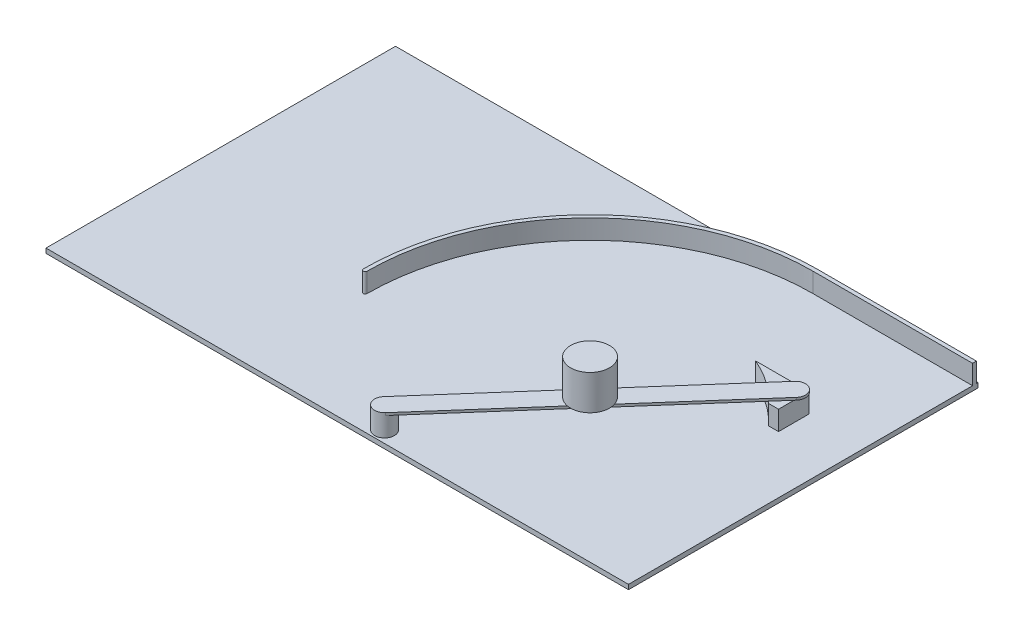
ISO-10303-21;
HEADER;
FILE_DESCRIPTION(('STEP AP214'),'2;1');
FILE_NAME('part.step','',(''),(''),'','','');
FILE_SCHEMA(('AUTOMOTIVE_DESIGN { 1 0 10303 214 1 1 1 1 }'));
ENDSEC;
DATA;
#1=APPLICATION_CONTEXT('core data for automotive mechanical design processes');
#2=APPLICATION_PROTOCOL_DEFINITION('international standard','automotive_design',2000,#1);
#3=PRODUCT_CONTEXT('',#1,'mechanical');
#4=PRODUCT('Part','Part','',(#3));
#5=PRODUCT_RELATED_PRODUCT_CATEGORY('part','',(#4));
#6=PRODUCT_DEFINITION_FORMATION('','',#4);
#7=PRODUCT_DEFINITION_CONTEXT('part definition',#1,'design');
#8=PRODUCT_DEFINITION('design','',#6,#7);
#9=PRODUCT_DEFINITION_SHAPE('','',#8);
#10=(LENGTH_UNIT() NAMED_UNIT(*) SI_UNIT(.MILLI.,.METRE.));
#11=(NAMED_UNIT(*) PLANE_ANGLE_UNIT() SI_UNIT($,.RADIAN.));
#12=(NAMED_UNIT(*) SI_UNIT($,.STERADIAN.) SOLID_ANGLE_UNIT());
#13=UNCERTAINTY_MEASURE_WITH_UNIT(LENGTH_MEASURE(1.E-05),#10,'distance_accuracy_value','');
#14=(GEOMETRIC_REPRESENTATION_CONTEXT(3) GLOBAL_UNCERTAINTY_ASSIGNED_CONTEXT((#13)) GLOBAL_UNIT_ASSIGNED_CONTEXT((#10,
#11,#12)) REPRESENTATION_CONTEXT('',''));
#15=CARTESIAN_POINT('',(0.,0.,0.));
#16=DIRECTION('',(0.,0.,1.));
#17=DIRECTION('',(1.,0.,0.));
#18=AXIS2_PLACEMENT_3D('',#15,#16,#17);
#19=CARTESIAN_POINT('',(91.5119390357836,68.35,419.73508776894));
#20=DIRECTION('',(0.,1.,0.));
#21=DIRECTION('',(0.,0.,1.));
#22=AXIS2_PLACEMENT_3D('',#19,#20,#21);
#23=PLANE('',#22);
#24=CARTESIAN_POINT('',(339.,68.35,138.));
#25=DIRECTION('',(0.,1.,0.));
#26=DIRECTION('',(0.,0.,1.));
#27=AXIS2_PLACEMENT_3D('',#24,#25,#26);
#28=CIRCLE('',#27,50.);
#29=CARTESIAN_POINT('',(386.506268712775,68.35,122.406590078191));
#30=VERTEX_POINT('',#29);
#31=CARTESIAN_POINT('',(348.340555489676,68.35,88.8802074195719));
#32=VERTEX_POINT('',#31);
#33=EDGE_CURVE('E50',#30,#32,#28,.T.);
#34=ORIENTED_EDGE('',*,*,#33,.F.);
#35=DIRECTION('',(0.659968162571244,0.,-0.75129356738384));
#36=VECTOR('',#35,1.);
#37=CARTESIAN_POINT('',(110.594795647333,68.35,436.498279098249));
#38=LINE('',#37,#36);
#39=CARTESIAN_POINT('',(605.570917575766,68.35,-126.97189643963));
#40=VERTEX_POINT('',#39);
#41=EDGE_CURVE('E200',#30,#40,#38,.T.);
#42=ORIENTED_EDGE('',*,*,#41,.T.);
#43=CARTESIAN_POINT('',(586.488060964216,68.35,-143.73508776894));
#44=DIRECTION('',(0.,1.,0.));
#45=DIRECTION('',(0.,0.,1.));
#46=AXIS2_PLACEMENT_3D('',#43,#44,#45);
#47=CIRCLE('',#46,25.4);
#48=CARTESIAN_POINT('',(567.405204352667,68.35,-160.498279098249));
#49=VERTEX_POINT('',#48);
#50=EDGE_CURVE('E197',#40,#49,#47,.T.);
#51=ORIENTED_EDGE('',*,*,#50,.T.);
#52=DIRECTION('',(-0.659968162571244,0.,0.75129356738384));
#53=VECTOR('',#52,1.);
#54=CARTESIAN_POINT('',(72.4290824242341,68.35,402.97189643963));
#55=LINE('',#54,#53);
#56=EDGE_CURVE('E230',#49,#32,#55,.T.);
#57=ORIENTED_EDGE('',*,*,#56,.T.);
#58=EDGE_LOOP('',(#34,#42,#51,#57));
#59=FACE_BOUND('',#58,.T.);
#60=ADVANCED_FACE('F39',(#59),#23,.T.);
#61=CARTESIAN_POINT('',(91.5119390357836,62.,419.73508776894));
#62=DIRECTION('',(0.,1.,0.));
#63=DIRECTION('',(0.,0.,1.));
#64=AXIS2_PLACEMENT_3D('',#61,#62,#63);
#65=PLANE('',#64);
#66=CARTESIAN_POINT('',(91.5119390357836,62.,419.73508776894));
#67=DIRECTION('',(0.,1.,0.));
#68=DIRECTION('',(0.,0.,1.));
#69=AXIS2_PLACEMENT_3D('',#66,#67,#68);
#70=CIRCLE('',#69,25.4);
#71=CARTESIAN_POINT('',(110.594795647333,62.,436.498279098249));
#72=VERTEX_POINT('',#71);
#73=CARTESIAN_POINT('',(72.429082424234,62.,402.97189643963));
#74=VERTEX_POINT('',#73);
#75=EDGE_CURVE('E223',#72,#74,#70,.T.);
#76=ORIENTED_EDGE('',*,*,#75,.T.);
#77=DIRECTION('',(-0.659968162571244,0.,0.75129356738384));
#78=VECTOR('',#77,1.);
#79=CARTESIAN_POINT('',(72.4290824242341,62.,402.97189643963));
#80=LINE('',#79,#78);
#81=CARTESIAN_POINT('',(534.015535145489,62.,-122.488197529021));
#82=VERTEX_POINT('',#81);
#83=EDGE_CURVE('E239',#82,#74,#80,.T.);
#84=ORIENTED_EDGE('',*,*,#83,.F.);
#85=CARTESIAN_POINT('',(339.,62.,138.));
#86=DIRECTION('',(0.,-1.,0.));
#87=DIRECTION('',(0.,0.,-1.));
#88=AXIS2_PLACEMENT_3D('',#85,#86,#87);
#89=CIRCLE('',#88,325.4);
#90=CARTESIAN_POINT('',(572.181248368588,62.,-88.9618148704022));
#91=VERTEX_POINT('',#90);
#92=EDGE_CURVE('E257',#82,#91,#89,.T.);
#93=ORIENTED_EDGE('',*,*,#92,.T.);
#94=DIRECTION('',(0.659968162571244,0.,-0.75129356738384));
#95=VECTOR('',#94,1.);
#96=CARTESIAN_POINT('',(110.594795647333,62.,436.498279098249));
#97=LINE('',#96,#95);
#98=EDGE_CURVE('E233',#72,#91,#97,.T.);
#99=ORIENTED_EDGE('',*,*,#98,.F.);
#100=EDGE_LOOP('',(#76,#84,#93,#99));
#101=FACE_BOUND('',#100,.T.);
#102=ADVANCED_FACE('F388',(#101),#65,.F.);
#103=CARTESIAN_POINT('',(339.,62.,138.));
#104=DIRECTION('',(0.,-1.,0.));
#105=DIRECTION('',(0.,0.,-1.));
#106=AXIS2_PLACEMENT_3D('',#103,#104,#105);
#107=PLANE('',#106);
#108=CARTESIAN_POINT('',(567.405204352667,62.,-160.498279098249));
#109=VERTEX_POINT('',#108);
#110=EDGE_CURVE('E226',#109,#82,#80,.T.);
#111=ORIENTED_EDGE('',*,*,#110,.F.);
#112=CARTESIAN_POINT('',(586.488060964216,62.,-143.73508776894));
#113=DIRECTION('',(0.,1.,0.));
#114=DIRECTION('',(0.,0.,1.));
#115=AXIS2_PLACEMENT_3D('',#112,#113,#114);
#116=CIRCLE('',#115,25.4);
#117=CARTESIAN_POINT('',(568.837197495488,62.,-162.));
#118=VERTEX_POINT('',#117);
#119=EDGE_CURVE('E48',#118,#109,#116,.T.);
#120=ORIENTED_EDGE('',*,*,#119,.F.);
#121=DIRECTION('',(-1.,0.,0.));
#122=VECTOR('',#121,1.);
#123=CARTESIAN_POINT('',(602.532735227345,62.,-162.));
#124=LINE('',#123,#122);
#125=CARTESIAN_POINT('',(465.036343964747,62.,-162.));
#126=VERTEX_POINT('',#125);
#127=EDGE_CURVE('E263',#118,#126,#124,.T.);
#128=ORIENTED_EDGE('',*,*,#127,.T.);
#129=EDGE_CURVE('E253',#126,#82,#89,.T.);
#130=ORIENTED_EDGE('',*,*,#129,.T.);
#131=EDGE_LOOP('',(#111,#120,#128,#130));
#132=FACE_BOUND('',#131,.T.);
#133=ADVANCED_FACE('F382',(#132),#107,.F.);
#134=CARTESIAN_POINT('',(602.532735227345,62.,-123.513294973138));
#135=VERTEX_POINT('',#134);
#136=EDGE_CURVE('E236',#91,#135,#97,.T.);
#137=ORIENTED_EDGE('',*,*,#136,.F.);
#138=CARTESIAN_POINT('',(577.132735227345,62.,-83.7610434975968));
#139=VERTEX_POINT('',#138);
#140=EDGE_CURVE('E258',#91,#139,#89,.T.);
#141=ORIENTED_EDGE('',*,*,#140,.T.);
#142=DIRECTION('',(1.,0.,0.));
#143=VECTOR('',#142,1.);
#144=CARTESIAN_POINT('',(602.532735227345,62.,-83.7610434975968));
#145=LINE('',#144,#143);
#146=CARTESIAN_POINT('',(602.532735227345,62.,-83.7610434975968));
#147=VERTEX_POINT('',#146);
#148=EDGE_CURVE('E256',#139,#147,#145,.T.);
#149=ORIENTED_EDGE('',*,*,#148,.T.);
#150=DIRECTION('',(0.,0.,-1.));
#151=VECTOR('',#150,1.);
#152=CARTESIAN_POINT('',(602.532735227345,62.,-162.));
#153=LINE('',#152,#151);
#154=EDGE_CURVE('E261',#147,#135,#153,.T.);
#155=ORIENTED_EDGE('',*,*,#154,.T.);
#156=EDGE_LOOP('',(#137,#141,#149,#155));
#157=FACE_BOUND('',#156,.T.);
#158=ADVANCED_FACE('F417',(#157),#107,.F.);
#159=CARTESIAN_POINT('',(0.,12.,0.));
#160=DIRECTION('',(0.,1.,0.));
#161=DIRECTION('',(0.,0.,1.));
#162=AXIS2_PLACEMENT_3D('',#159,#160,#161);
#163=PLANE('',#162);
#164=CARTESIAN_POINT('',(91.5119390357836,12.,419.73508776894));
#165=DIRECTION('',(0.,1.,0.));
#166=DIRECTION('',(0.,0.,1.));
#167=AXIS2_PLACEMENT_3D('',#164,#165,#166);
#168=CIRCLE('',#167,25.4);
#169=CARTESIAN_POINT('',(91.5119390357836,12.,445.13508776894));
#170=VERTEX_POINT('',#169);
#171=EDGE_CURVE('E220',#170,#170,#168,.T.);
#172=ORIENTED_EDGE('',*,*,#171,.F.);
#173=EDGE_LOOP('',(#172));
#174=FACE_BOUND('',#173,.T.);
#175=DIRECTION('',(1.,0.,0.));
#176=VECTOR('',#175,1.);
#177=CARTESIAN_POINT('',(339.,12.,-436.));
#178=LINE('',#177,#176);
#179=CARTESIAN_POINT('',(339.,12.,-436.));
#180=VERTEX_POINT('',#179);
#181=CARTESIAN_POINT('',(750.,12.,-436.));
#182=VERTEX_POINT('',#181);
#183=EDGE_CURVE('E286',#180,#182,#178,.T.);
#184=ORIENTED_EDGE('',*,*,#183,.F.);
#185=CARTESIAN_POINT('',(339.,12.,138.));
#186=DIRECTION('',(0.,1.,0.));
#187=DIRECTION('',(0.,0.,1.));
#188=AXIS2_PLACEMENT_3D('',#185,#186,#187);
#189=CIRCLE('',#188,574.);
#190=CARTESIAN_POINT('',(-235.,12.,138.));
#191=VERTEX_POINT('',#190);
#192=EDGE_CURVE('E290',#180,#191,#189,.T.);
#193=ORIENTED_EDGE('',*,*,#192,.T.);
#194=CARTESIAN_POINT('',(-240.,12.,138.));
#195=DIRECTION('',(0.,-1.,0.));
#196=DIRECTION('',(0.,0.,-1.));
#197=AXIS2_PLACEMENT_3D('',#194,#195,#196);
#198=CIRCLE('',#197,5.);
#199=CARTESIAN_POINT('',(-245.,12.,138.));
#200=VERTEX_POINT('',#199);
#201=EDGE_CURVE('E313',#191,#200,#198,.T.);
#202=ORIENTED_EDGE('',*,*,#201,.T.);
#203=CARTESIAN_POINT('',(339.,12.,138.));
#204=DIRECTION('',(0.,1.,0.));
#205=DIRECTION('',(0.,0.,1.));
#206=AXIS2_PLACEMENT_3D('',#203,#204,#205);
#207=CIRCLE('',#206,584.);
#208=CARTESIAN_POINT('',(339.,12.,-446.));
#209=VERTEX_POINT('',#208);
#210=EDGE_CURVE('E310',#209,#200,#207,.T.);
#211=ORIENTED_EDGE('',*,*,#210,.F.);
#212=DIRECTION('',(1.,0.,0.));
#213=VECTOR('',#212,1.);
#214=CARTESIAN_POINT('',(339.,12.,-446.));
#215=LINE('',#214,#213);
#216=CARTESIAN_POINT('',(750.,12.,-446.));
#217=VERTEX_POINT('',#216);
#218=EDGE_CURVE('E307',#209,#217,#215,.T.);
#219=ORIENTED_EDGE('',*,*,#218,.T.);
#220=DIRECTION('',(0.,0.,-1.));
#221=VECTOR('',#220,1.);
#222=CARTESIAN_POINT('',(750.,12.,450.));
#223=LINE('',#222,#221);
#224=CARTESIAN_POINT('',(750.,12.,-450.));
#225=VERTEX_POINT('',#224);
#226=EDGE_CURVE('E336',#217,#225,#223,.T.);
#227=ORIENTED_EDGE('',*,*,#226,.T.);
#228=DIRECTION('',(-1.,0.,0.));
#229=VECTOR('',#228,1.);
#230=CARTESIAN_POINT('',(750.,12.,-450.));
#231=LINE('',#230,#229);
#232=CARTESIAN_POINT('',(-750.,12.,-450.));
#233=VERTEX_POINT('',#232);
#234=EDGE_CURVE('E340',#225,#233,#231,.T.);
#235=ORIENTED_EDGE('',*,*,#234,.T.);
#236=DIRECTION('',(0.,0.,1.));
#237=VECTOR('',#236,1.);
#238=CARTESIAN_POINT('',(-750.,12.,450.));
#239=LINE('',#238,#237);
#240=CARTESIAN_POINT('',(-750.,12.,450.));
#241=VERTEX_POINT('',#240);
#242=EDGE_CURVE('E330',#233,#241,#239,.T.);
#243=ORIENTED_EDGE('',*,*,#242,.T.);
#244=DIRECTION('',(1.,0.,0.));
#245=VECTOR('',#244,1.);
#246=CARTESIAN_POINT('',(750.,12.,450.));
#247=LINE('',#246,#245);
#248=CARTESIAN_POINT('',(750.,12.,450.));
#249=VERTEX_POINT('',#248);
#250=EDGE_CURVE('E333',#241,#249,#247,.T.);
#251=ORIENTED_EDGE('',*,*,#250,.T.);
#252=EDGE_CURVE('E337',#249,#182,#223,.T.);
#253=ORIENTED_EDGE('',*,*,#252,.T.);
#254=EDGE_LOOP('',(#184,#193,#202,#211,#219,#227,#235,#243,#251,#253));
#255=FACE_BOUND('',#254,.T.);
#256=DIRECTION('',(1.,0.,0.));
#257=VECTOR('',#256,1.);
#258=CARTESIAN_POINT('',(602.532735227345,12.,-83.7610434975968));
#259=LINE('',#258,#257);
#260=CARTESIAN_POINT('',(577.132735227345,12.,-83.7610434975968));
#261=VERTEX_POINT('',#260);
#262=CARTESIAN_POINT('',(602.532735227345,12.,-83.7610434975968));
#263=VERTEX_POINT('',#262);
#264=EDGE_CURVE('E270',#261,#263,#259,.T.);
#265=ORIENTED_EDGE('',*,*,#264,.F.);
#266=CARTESIAN_POINT('',(339.,12.,138.));
#267=DIRECTION('',(0.,-1.,0.));
#268=DIRECTION('',(0.,0.,-1.));
#269=AXIS2_PLACEMENT_3D('',#266,#267,#268);
#270=CIRCLE('',#269,325.4);
#271=CARTESIAN_POINT('',(465.036343964747,12.,-162.));
#272=VERTEX_POINT('',#271);
#273=EDGE_CURVE('E252',#272,#261,#270,.T.);
#274=ORIENTED_EDGE('',*,*,#273,.F.);
#275=DIRECTION('',(-1.,0.,0.));
#276=VECTOR('',#275,1.);
#277=CARTESIAN_POINT('',(602.532735227345,12.,-162.));
#278=LINE('',#277,#276);
#279=CARTESIAN_POINT('',(602.532735227345,12.,-162.));
#280=VERTEX_POINT('',#279);
#281=EDGE_CURVE('E275',#280,#272,#278,.T.);
#282=ORIENTED_EDGE('',*,*,#281,.F.);
#283=DIRECTION('',(0.,0.,-1.));
#284=VECTOR('',#283,1.);
#285=CARTESIAN_POINT('',(602.532735227345,12.,-162.));
#286=LINE('',#285,#284);
#287=EDGE_CURVE('E272',#263,#280,#286,.T.);
#288=ORIENTED_EDGE('',*,*,#287,.F.);
#289=EDGE_LOOP('',(#265,#274,#282,#288));
#290=FACE_BOUND('',#289,.T.);
#291=ADVANCED_FACE('F457',(#174,#255,#290),#163,.T.);
#292=CARTESIAN_POINT('',(-750.,12.,450.));
#293=DIRECTION('',(1.,0.,0.));
#294=DIRECTION('',(0.,0.,-1.));
#295=AXIS2_PLACEMENT_3D('',#292,#293,#294);
#296=PLANE('',#295);
#297=DIRECTION('',(0.,0.,1.));
#298=VECTOR('',#297,1.);
#299=CARTESIAN_POINT('',(-750.,0.,450.));
#300=LINE('',#299,#298);
#301=CARTESIAN_POINT('',(-750.,0.,-450.));
#302=VERTEX_POINT('',#301);
#303=CARTESIAN_POINT('',(-750.,0.,450.));
#304=VERTEX_POINT('',#303);
#305=EDGE_CURVE('E329',#302,#304,#300,.T.);
#306=ORIENTED_EDGE('',*,*,#305,.T.);
#307=DIRECTION('',(0.,-1.,0.));
#308=VECTOR('',#307,1.);
#309=CARTESIAN_POINT('',(-750.,12.,450.));
#310=LINE('',#309,#308);
#311=EDGE_CURVE('E43',#241,#304,#310,.T.);
#312=ORIENTED_EDGE('',*,*,#311,.F.);
#313=ORIENTED_EDGE('',*,*,#242,.F.);
#314=DIRECTION('',(0.,-1.,0.));
#315=VECTOR('',#314,1.);
#316=CARTESIAN_POINT('',(-750.,12.,-450.));
#317=LINE('',#316,#315);
#318=EDGE_CURVE('E342',#233,#302,#317,.T.);
#319=ORIENTED_EDGE('',*,*,#318,.T.);
#320=EDGE_LOOP('',(#306,#312,#313,#319));
#321=FACE_BOUND('',#320,.T.);
#322=ADVANCED_FACE('F41',(#321),#296,.F.);
#323=CARTESIAN_POINT('',(750.,12.,450.));
#324=DIRECTION('',(0.,0.,-1.));
#325=DIRECTION('',(-1.,0.,0.));
#326=AXIS2_PLACEMENT_3D('',#323,#324,#325);
#327=PLANE('',#326);
#328=DIRECTION('',(1.,0.,0.));
#329=VECTOR('',#328,1.);
#330=CARTESIAN_POINT('',(750.,0.,450.));
#331=LINE('',#330,#329);
#332=CARTESIAN_POINT('',(750.,0.,450.));
#333=VERTEX_POINT('',#332);
#334=EDGE_CURVE('E345',#304,#333,#331,.T.);
#335=ORIENTED_EDGE('',*,*,#334,.T.);
#336=DIRECTION('',(0.,-1.,0.));
#337=VECTOR('',#336,1.);
#338=CARTESIAN_POINT('',(750.,12.,450.));
#339=LINE('',#338,#337);
#340=EDGE_CURVE('E354',#249,#333,#339,.T.);
#341=ORIENTED_EDGE('',*,*,#340,.F.);
#342=ORIENTED_EDGE('',*,*,#250,.F.);
#343=ORIENTED_EDGE('',*,*,#311,.T.);
#344=EDGE_LOOP('',(#335,#341,#342,#343));
#345=FACE_BOUND('',#344,.T.);
#346=ADVANCED_FACE('F470',(#345),#327,.F.);
#347=CARTESIAN_POINT('',(750.,12.,450.));
#348=DIRECTION('',(-1.,0.,0.));
#349=DIRECTION('',(0.,0.,1.));
#350=AXIS2_PLACEMENT_3D('',#347,#348,#349);
#351=PLANE('',#350);
#352=DIRECTION('',(0.,0.,-1.));
#353=VECTOR('',#352,1.);
#354=CARTESIAN_POINT('',(750.,0.,450.));
#355=LINE('',#354,#353);
#356=CARTESIAN_POINT('',(750.,0.,-450.));
#357=VERTEX_POINT('',#356);
#358=EDGE_CURVE('E347',#333,#357,#355,.T.);
#359=ORIENTED_EDGE('',*,*,#358,.T.);
#360=DIRECTION('',(0.,-1.,0.));
#361=VECTOR('',#360,1.);
#362=CARTESIAN_POINT('',(750.,12.,-450.));
#363=LINE('',#362,#361);
#364=EDGE_CURVE('E352',#225,#357,#363,.T.);
#365=ORIENTED_EDGE('',*,*,#364,.F.);
#366=ORIENTED_EDGE('',*,*,#226,.F.);
#367=DIRECTION('',(0.,-1.,0.));
#368=VECTOR('',#367,1.);
#369=CARTESIAN_POINT('',(750.,62.,-446.));
#370=LINE('',#369,#368);
#371=CARTESIAN_POINT('',(750.,62.,-446.));
#372=VERTEX_POINT('',#371);
#373=EDGE_CURVE('E325',#372,#217,#370,.T.);
#374=ORIENTED_EDGE('',*,*,#373,.F.);
#375=DIRECTION('',(0.,0.,1.));
#376=VECTOR('',#375,1.);
#377=CARTESIAN_POINT('',(750.,62.,-446.));
#378=LINE('',#377,#376);
#379=CARTESIAN_POINT('',(750.,62.,-436.));
#380=VERTEX_POINT('',#379);
#381=EDGE_CURVE('E289',#372,#380,#378,.T.);
#382=ORIENTED_EDGE('',*,*,#381,.T.);
#383=DIRECTION('',(0.,-1.,0.));
#384=VECTOR('',#383,1.);
#385=CARTESIAN_POINT('',(750.,62.,-436.));
#386=LINE('',#385,#384);
#387=EDGE_CURVE('E327',#380,#182,#386,.T.);
#388=ORIENTED_EDGE('',*,*,#387,.T.);
#389=ORIENTED_EDGE('',*,*,#252,.F.);
#390=ORIENTED_EDGE('',*,*,#340,.T.);
#391=EDGE_LOOP('',(#359,#365,#366,#374,#382,#388,#389,#390));
#392=FACE_BOUND('',#391,.T.);
#393=ADVANCED_FACE('F467',(#392),#351,.F.);
#394=CARTESIAN_POINT('',(750.,12.,-450.));
#395=DIRECTION('',(0.,0.,1.));
#396=DIRECTION('',(1.,0.,0.));
#397=AXIS2_PLACEMENT_3D('',#394,#395,#396);
#398=PLANE('',#397);
#399=DIRECTION('',(-1.,0.,0.));
#400=VECTOR('',#399,1.);
#401=CARTESIAN_POINT('',(750.,0.,-450.));
#402=LINE('',#401,#400);
#403=EDGE_CURVE('E334',#357,#302,#402,.T.);
#404=ORIENTED_EDGE('',*,*,#403,.T.);
#405=ORIENTED_EDGE('',*,*,#318,.F.);
#406=ORIENTED_EDGE('',*,*,#234,.F.);
#407=ORIENTED_EDGE('',*,*,#364,.T.);
#408=EDGE_LOOP('',(#404,#405,#406,#407));
#409=FACE_BOUND('',#408,.T.);
#410=ADVANCED_FACE('F463',(#409),#398,.F.);
#411=CARTESIAN_POINT('',(0.,0.,0.));
#412=DIRECTION('',(0.,1.,0.));
#413=DIRECTION('',(0.,0.,1.));
#414=AXIS2_PLACEMENT_3D('',#411,#412,#413);
#415=PLANE('',#414);
#416=ORIENTED_EDGE('',*,*,#305,.F.);
#417=ORIENTED_EDGE('',*,*,#403,.F.);
#418=ORIENTED_EDGE('',*,*,#358,.F.);
#419=ORIENTED_EDGE('',*,*,#334,.F.);
#420=EDGE_LOOP('',(#416,#417,#418,#419));
#421=FACE_BOUND('',#420,.T.);
#422=ADVANCED_FACE('F455',(#421),#415,.F.);
#423=CARTESIAN_POINT('',(339.,62.,-436.));
#424=DIRECTION('',(0.,0.,-1.));
#425=DIRECTION('',(-1.,0.,0.));
#426=AXIS2_PLACEMENT_3D('',#423,#424,#425);
#427=PLANE('',#426);
#428=ORIENTED_EDGE('',*,*,#183,.T.);
#429=ORIENTED_EDGE('',*,*,#387,.F.);
#430=DIRECTION('',(1.,0.,0.));
#431=VECTOR('',#430,1.);
#432=CARTESIAN_POINT('',(339.,62.,-436.));
#433=LINE('',#432,#431);
#434=CARTESIAN_POINT('',(339.,62.,-436.));
#435=VERTEX_POINT('',#434);
#436=EDGE_CURVE('E287',#435,#380,#433,.T.);
#437=ORIENTED_EDGE('',*,*,#436,.F.);
#438=DIRECTION('',(0.,-1.,0.));
#439=VECTOR('',#438,1.);
#440=CARTESIAN_POINT('',(339.,62.,-436.));
#441=LINE('',#440,#439);
#442=EDGE_CURVE('E304',#435,#180,#441,.T.);
#443=ORIENTED_EDGE('',*,*,#442,.T.);
#444=EDGE_LOOP('',(#428,#429,#437,#443));
#445=FACE_BOUND('',#444,.T.);
#446=ADVANCED_FACE('F451',(#445),#427,.F.);
#447=CARTESIAN_POINT('',(339.,62.,-446.));
#448=DIRECTION('',(0.,0.,-1.));
#449=DIRECTION('',(-1.,0.,0.));
#450=AXIS2_PLACEMENT_3D('',#447,#448,#449);
#451=PLANE('',#450);
#452=ORIENTED_EDGE('',*,*,#218,.F.);
#453=DIRECTION('',(0.,-1.,0.));
#454=VECTOR('',#453,1.);
#455=CARTESIAN_POINT('',(339.,62.,-446.));
#456=LINE('',#455,#454);
#457=CARTESIAN_POINT('',(339.,62.,-446.));
#458=VERTEX_POINT('',#457);
#459=EDGE_CURVE('E323',#458,#209,#456,.T.);
#460=ORIENTED_EDGE('',*,*,#459,.F.);
#461=DIRECTION('',(1.,0.,0.));
#462=VECTOR('',#461,1.);
#463=CARTESIAN_POINT('',(339.,62.,-446.));
#464=LINE('',#463,#462);
#465=EDGE_CURVE('E293',#458,#372,#464,.T.);
#466=ORIENTED_EDGE('',*,*,#465,.T.);
#467=ORIENTED_EDGE('',*,*,#373,.T.);
#468=EDGE_LOOP('',(#452,#460,#466,#467));
#469=FACE_BOUND('',#468,.T.);
#470=ADVANCED_FACE('F447',(#469),#451,.T.);
#471=CARTESIAN_POINT('',(339.,62.,138.));
#472=DIRECTION('',(0.,-1.,0.));
#473=DIRECTION('',(0.,0.,-1.));
#474=AXIS2_PLACEMENT_3D('',#471,#472,#473);
#475=CYLINDRICAL_SURFACE('',#474,584.);
#476=ORIENTED_EDGE('',*,*,#210,.T.);
#477=DIRECTION('',(0.,-1.,0.));
#478=VECTOR('',#477,1.);
#479=CARTESIAN_POINT('',(-245.,62.,138.));
#480=LINE('',#479,#478);
#481=CARTESIAN_POINT('',(-245.,62.,138.));
#482=VERTEX_POINT('',#481);
#483=EDGE_CURVE('E321',#482,#200,#480,.T.);
#484=ORIENTED_EDGE('',*,*,#483,.F.);
#485=CARTESIAN_POINT('',(339.,62.,138.));
#486=DIRECTION('',(0.,1.,0.));
#487=DIRECTION('',(0.,0.,1.));
#488=AXIS2_PLACEMENT_3D('',#485,#486,#487);
#489=CIRCLE('',#488,584.);
#490=EDGE_CURVE('E296',#458,#482,#489,.T.);
#491=ORIENTED_EDGE('',*,*,#490,.F.);
#492=ORIENTED_EDGE('',*,*,#459,.T.);
#493=EDGE_LOOP('',(#476,#484,#491,#492));
#494=FACE_BOUND('',#493,.T.);
#495=ADVANCED_FACE('F443',(#494),#475,.T.);
#496=CARTESIAN_POINT('',(-240.,62.,138.));
#497=DIRECTION('',(0.,-1.,0.));
#498=DIRECTION('',(0.,0.,-1.));
#499=AXIS2_PLACEMENT_3D('',#496,#497,#498);
#500=CYLINDRICAL_SURFACE('',#499,5.);
#501=ORIENTED_EDGE('',*,*,#201,.F.);
#502=DIRECTION('',(0.,-1.,0.));
#503=VECTOR('',#502,1.);
#504=CARTESIAN_POINT('',(-235.,62.,138.));
#505=LINE('',#504,#503);
#506=CARTESIAN_POINT('',(-235.,62.,138.));
#507=VERTEX_POINT('',#506);
#508=EDGE_CURVE('E319',#507,#191,#505,.T.);
#509=ORIENTED_EDGE('',*,*,#508,.F.);
#510=CARTESIAN_POINT('',(-240.,62.,138.));
#511=DIRECTION('',(0.,-1.,0.));
#512=DIRECTION('',(0.,0.,-1.));
#513=AXIS2_PLACEMENT_3D('',#510,#511,#512);
#514=CIRCLE('',#513,5.);
#515=EDGE_CURVE('E298',#507,#482,#514,.T.);
#516=ORIENTED_EDGE('',*,*,#515,.T.);
#517=ORIENTED_EDGE('',*,*,#483,.T.);
#518=EDGE_LOOP('',(#501,#509,#516,#517));
#519=FACE_BOUND('',#518,.T.);
#520=ADVANCED_FACE('F439',(#519),#500,.T.);
#521=CARTESIAN_POINT('',(339.,62.,138.));
#522=DIRECTION('',(0.,-1.,0.));
#523=DIRECTION('',(0.,0.,-1.));
#524=AXIS2_PLACEMENT_3D('',#521,#522,#523);
#525=CYLINDRICAL_SURFACE('',#524,574.);
#526=ORIENTED_EDGE('',*,*,#192,.F.);
#527=ORIENTED_EDGE('',*,*,#442,.F.);
#528=CARTESIAN_POINT('',(339.,62.,138.));
#529=DIRECTION('',(0.,1.,0.));
#530=DIRECTION('',(0.,0.,1.));
#531=AXIS2_PLACEMENT_3D('',#528,#529,#530);
#532=CIRCLE('',#531,574.);
#533=EDGE_CURVE('E301',#435,#507,#532,.T.);
#534=ORIENTED_EDGE('',*,*,#533,.T.);
#535=ORIENTED_EDGE('',*,*,#508,.T.);
#536=EDGE_LOOP('',(#526,#527,#534,#535));
#537=FACE_BOUND('',#536,.T.);
#538=ADVANCED_FACE('F435',(#537),#525,.F.);
#539=CARTESIAN_POINT('',(339.,62.,138.));
#540=DIRECTION('',(0.,1.,0.));
#541=DIRECTION('',(0.,0.,1.));
#542=AXIS2_PLACEMENT_3D('',#539,#540,#541);
#543=PLANE('',#542);
#544=ORIENTED_EDGE('',*,*,#436,.T.);
#545=ORIENTED_EDGE('',*,*,#381,.F.);
#546=ORIENTED_EDGE('',*,*,#465,.F.);
#547=ORIENTED_EDGE('',*,*,#490,.T.);
#548=ORIENTED_EDGE('',*,*,#515,.F.);
#549=ORIENTED_EDGE('',*,*,#533,.F.);
#550=EDGE_LOOP('',(#544,#545,#546,#547,#548,#549));
#551=FACE_BOUND('',#550,.T.);
#552=ADVANCED_FACE('F431',(#551),#543,.T.);
#553=CARTESIAN_POINT('',(339.,62.,138.));
#554=DIRECTION('',(0.,-1.,0.));
#555=DIRECTION('',(0.,0.,-1.));
#556=AXIS2_PLACEMENT_3D('',#553,#554,#555);
#557=CYLINDRICAL_SURFACE('',#556,325.4);
#558=ORIENTED_EDGE('',*,*,#273,.T.);
#559=DIRECTION('',(0.,-1.,0.));
#560=VECTOR('',#559,1.);
#561=CARTESIAN_POINT('',(577.132735227345,62.,-83.7610434975968));
#562=LINE('',#561,#560);
#563=EDGE_CURVE('E284',#139,#261,#562,.T.);
#564=ORIENTED_EDGE('',*,*,#563,.F.);
#565=ORIENTED_EDGE('',*,*,#140,.F.);
#566=ORIENTED_EDGE('',*,*,#92,.F.);
#567=ORIENTED_EDGE('',*,*,#129,.F.);
#568=DIRECTION('',(0.,-1.,0.));
#569=VECTOR('',#568,1.);
#570=CARTESIAN_POINT('',(465.036343964747,62.,-162.));
#571=LINE('',#570,#569);
#572=EDGE_CURVE('E267',#126,#272,#571,.T.);
#573=ORIENTED_EDGE('',*,*,#572,.T.);
#574=EDGE_LOOP('',(#558,#564,#565,#566,#567,#573));
#575=FACE_BOUND('',#574,.T.);
#576=ADVANCED_FACE('F427',(#575),#557,.F.);
#577=CARTESIAN_POINT('',(602.532735227345,62.,-83.7610434975968));
#578=DIRECTION('',(0.,0.,-1.));
#579=DIRECTION('',(-1.,0.,0.));
#580=AXIS2_PLACEMENT_3D('',#577,#578,#579);
#581=PLANE('',#580);
#582=ORIENTED_EDGE('',*,*,#264,.T.);
#583=DIRECTION('',(0.,-1.,0.));
#584=VECTOR('',#583,1.);
#585=CARTESIAN_POINT('',(602.532735227345,62.,-83.7610434975968));
#586=LINE('',#585,#584);
#587=EDGE_CURVE('E281',#147,#263,#586,.T.);
#588=ORIENTED_EDGE('',*,*,#587,.F.);
#589=ORIENTED_EDGE('',*,*,#148,.F.);
#590=ORIENTED_EDGE('',*,*,#563,.T.);
#591=EDGE_LOOP('',(#582,#588,#589,#590));
#592=FACE_BOUND('',#591,.T.);
#593=ADVANCED_FACE('F423',(#592),#581,.F.);
#594=CARTESIAN_POINT('',(602.532735227345,62.,-162.));
#595=DIRECTION('',(-1.,0.,0.));
#596=DIRECTION('',(0.,0.,1.));
#597=AXIS2_PLACEMENT_3D('',#594,#595,#596);
#598=PLANE('',#597);
#599=ORIENTED_EDGE('',*,*,#287,.T.);
#600=DIRECTION('',(0.,-1.,0.));
#601=VECTOR('',#600,1.);
#602=CARTESIAN_POINT('',(602.532735227345,62.,-162.));
#603=LINE('',#602,#601);
#604=CARTESIAN_POINT('',(602.532735227345,62.,-162.));
#605=VERTEX_POINT('',#604);
#606=EDGE_CURVE('E279',#605,#280,#603,.T.);
#607=ORIENTED_EDGE('',*,*,#606,.F.);
#608=EDGE_CURVE('E260',#135,#605,#153,.T.);
#609=ORIENTED_EDGE('',*,*,#608,.F.);
#610=ORIENTED_EDGE('',*,*,#154,.F.);
#611=ORIENTED_EDGE('',*,*,#587,.T.);
#612=EDGE_LOOP('',(#599,#607,#609,#610,#611));
#613=FACE_BOUND('',#612,.T.);
#614=ADVANCED_FACE('F420',(#613),#598,.F.);
#615=CARTESIAN_POINT('',(602.532735227345,62.,-162.));
#616=DIRECTION('',(0.,0.,1.));
#617=DIRECTION('',(1.,0.,0.));
#618=AXIS2_PLACEMENT_3D('',#615,#616,#617);
#619=PLANE('',#618);
#620=ORIENTED_EDGE('',*,*,#281,.T.);
#621=ORIENTED_EDGE('',*,*,#572,.F.);
#622=ORIENTED_EDGE('',*,*,#127,.F.);
#623=EDGE_CURVE('E264',#605,#118,#124,.T.);
#624=ORIENTED_EDGE('',*,*,#623,.F.);
#625=ORIENTED_EDGE('',*,*,#606,.T.);
#626=EDGE_LOOP('',(#620,#621,#622,#624,#625));
#627=FACE_BOUND('',#626,.T.);
#628=ADVANCED_FACE('F378',(#627),#619,.F.);
#629=CARTESIAN_POINT('',(605.570917575766,62.,-126.97189643963));
#630=VERTEX_POINT('',#629);
#631=EDGE_CURVE('E225',#135,#630,#97,.T.);
#632=ORIENTED_EDGE('',*,*,#631,.F.);
#633=ORIENTED_EDGE('',*,*,#608,.T.);
#634=ORIENTED_EDGE('',*,*,#623,.T.);
#635=EDGE_CURVE('E235',#630,#118,#116,.T.);
#636=ORIENTED_EDGE('',*,*,#635,.F.);
#637=EDGE_LOOP('',(#632,#633,#634,#636));
#638=FACE_BOUND('',#637,.T.);
#639=ADVANCED_FACE('F373',(#638),#65,.F.);
#640=CARTESIAN_POINT('',(91.5119390357836,68.35,419.73508776894));
#641=DIRECTION('',(0.,-1.,0.));
#642=DIRECTION('',(0.,0.,-1.));
#643=AXIS2_PLACEMENT_3D('',#640,#641,#642);
#644=CYLINDRICAL_SURFACE('',#643,25.4);
#645=DIRECTION('',(0.,-1.,0.));
#646=VECTOR('',#645,1.);
#647=CARTESIAN_POINT('',(72.4290824242341,68.35,402.97189643963));
#648=LINE('',#647,#646);
#649=CARTESIAN_POINT('',(72.4290824242341,68.35,402.97189643963));
#650=VERTEX_POINT('',#649);
#651=EDGE_CURVE('E232',#650,#74,#648,.T.);
#652=ORIENTED_EDGE('',*,*,#651,.T.);
#653=ORIENTED_EDGE('',*,*,#75,.F.);
#654=DIRECTION('',(0.,-1.,0.));
#655=VECTOR('',#654,1.);
#656=CARTESIAN_POINT('',(110.594795647333,68.35,436.498279098249));
#657=LINE('',#656,#655);
#658=CARTESIAN_POINT('',(110.594795647333,68.35,436.498279098249));
#659=VERTEX_POINT('',#658);
#660=EDGE_CURVE('E250',#659,#72,#657,.T.);
#661=ORIENTED_EDGE('',*,*,#660,.F.);
#662=CARTESIAN_POINT('',(91.5119390357836,68.35,419.73508776894));
#663=DIRECTION('',(0.,1.,0.));
#664=DIRECTION('',(0.,0.,1.));
#665=AXIS2_PLACEMENT_3D('',#662,#663,#664);
#666=CIRCLE('',#665,25.4);
#667=EDGE_CURVE('E193',#650,#659,#666,.T.);
#668=ORIENTED_EDGE('',*,*,#667,.F.);
#669=EDGE_LOOP('',(#652,#653,#661,#668));
#670=FACE_BOUND('',#669,.T.);
#671=ORIENTED_EDGE('',*,*,#171,.T.);
#672=EDGE_LOOP('',(#671));
#673=FACE_BOUND('',#672,.T.);
#674=ADVANCED_FACE('F411',(#670,#673),#644,.T.);
#675=CARTESIAN_POINT('',(110.594795647333,68.35,436.498279098249));
#676=DIRECTION('',(-0.75129356738384,0.,-0.659968162571244));
#677=DIRECTION('',(-0.659968162571244,0.,0.75129356738384));
#678=AXIS2_PLACEMENT_3D('',#675,#676,#677);
#679=PLANE('',#678);
#680=ORIENTED_EDGE('',*,*,#98,.T.);
#681=ORIENTED_EDGE('',*,*,#136,.T.);
#682=ORIENTED_EDGE('',*,*,#631,.T.);
#683=DIRECTION('',(0.,-1.,0.));
#684=VECTOR('',#683,1.);
#685=CARTESIAN_POINT('',(605.570917575766,68.35,-126.97189643963));
#686=LINE('',#685,#684);
#687=EDGE_CURVE('E247',#40,#630,#686,.T.);
#688=ORIENTED_EDGE('',*,*,#687,.F.);
#689=ORIENTED_EDGE('',*,*,#41,.F.);
#690=CARTESIAN_POINT('',(329.659444510323,68.35,187.119792580428));
#691=VERTEX_POINT('',#690);
#692=EDGE_CURVE('E198',#691,#30,#38,.T.);
#693=ORIENTED_EDGE('',*,*,#692,.F.);
#694=EDGE_CURVE('E189',#659,#691,#38,.T.);
#695=ORIENTED_EDGE('',*,*,#694,.F.);
#696=ORIENTED_EDGE('',*,*,#660,.T.);
#697=EDGE_LOOP('',(#680,#681,#682,#688,#689,#693,#695,#696));
#698=FACE_BOUND('',#697,.T.);
#699=ADVANCED_FACE('F205',(#698),#679,.F.);
#700=CARTESIAN_POINT('',(586.488060964216,68.35,-143.73508776894));
#701=DIRECTION('',(0.,-1.,0.));
#702=DIRECTION('',(0.,0.,-1.));
#703=AXIS2_PLACEMENT_3D('',#700,#701,#702);
#704=CYLINDRICAL_SURFACE('',#703,25.4);
#705=ORIENTED_EDGE('',*,*,#635,.T.);
#706=ORIENTED_EDGE('',*,*,#119,.T.);
#707=DIRECTION('',(0.,-1.,0.));
#708=VECTOR('',#707,1.);
#709=CARTESIAN_POINT('',(567.405204352667,68.35,-160.498279098249));
#710=LINE('',#709,#708);
#711=EDGE_CURVE('E244',#49,#109,#710,.T.);
#712=ORIENTED_EDGE('',*,*,#711,.F.);
#713=ORIENTED_EDGE('',*,*,#50,.F.);
#714=ORIENTED_EDGE('',*,*,#687,.T.);
#715=EDGE_LOOP('',(#705,#706,#712,#713,#714));
#716=FACE_BOUND('',#715,.T.);
#717=ADVANCED_FACE('F371',(#716),#704,.T.);
#718=CARTESIAN_POINT('',(72.4290824242341,68.35,402.97189643963));
#719=DIRECTION('',(0.75129356738384,0.,0.659968162571244));
#720=DIRECTION('',(0.659968162571244,0.,-0.75129356738384));
#721=AXIS2_PLACEMENT_3D('',#718,#719,#720);
#722=PLANE('',#721);
#723=ORIENTED_EDGE('',*,*,#110,.T.);
#724=ORIENTED_EDGE('',*,*,#83,.T.);
#725=ORIENTED_EDGE('',*,*,#651,.F.);
#726=CARTESIAN_POINT('',(291.493731287224,68.35,153.593409921809));
#727=VERTEX_POINT('',#726);
#728=EDGE_CURVE('E229',#727,#650,#55,.T.);
#729=ORIENTED_EDGE('',*,*,#728,.F.);
#730=EDGE_CURVE('E63',#32,#727,#55,.T.);
#731=ORIENTED_EDGE('',*,*,#730,.F.);
#732=ORIENTED_EDGE('',*,*,#56,.F.);
#733=ORIENTED_EDGE('',*,*,#711,.T.);
#734=EDGE_LOOP('',(#723,#724,#725,#729,#731,#732,#733));
#735=FACE_BOUND('',#734,.T.);
#736=ADVANCED_FACE('F384',(#735),#722,.F.);
#737=EDGE_CURVE('E11',#727,#691,#28,.T.);
#738=ORIENTED_EDGE('',*,*,#737,.F.);
#739=ORIENTED_EDGE('',*,*,#728,.T.);
#740=ORIENTED_EDGE('',*,*,#667,.T.);
#741=ORIENTED_EDGE('',*,*,#694,.T.);
#742=EDGE_LOOP('',(#738,#739,#740,#741));
#743=FACE_BOUND('',#742,.T.);
#744=ADVANCED_FACE('F191',(#743),#23,.T.);
#745=CARTESIAN_POINT('',(339.,68.35,138.));
#746=DIRECTION('',(0.,1.,0.));
#747=DIRECTION('',(0.,0.,1.));
#748=AXIS2_PLACEMENT_3D('',#745,#746,#747);
#749=PLANE('',#748);
#750=EDGE_CURVE('E209',#691,#30,#28,.T.);
#751=ORIENTED_EDGE('',*,*,#750,.F.);
#752=ORIENTED_EDGE('',*,*,#692,.T.);
#753=EDGE_LOOP('',(#751,#752));
#754=FACE_BOUND('',#753,.T.);
#755=ADVANCED_FACE('F210',(#754),#749,.F.);
#756=EDGE_CURVE('E51',#32,#727,#28,.T.);
#757=ORIENTED_EDGE('',*,*,#756,.F.);
#758=ORIENTED_EDGE('',*,*,#730,.T.);
#759=EDGE_LOOP('',(#757,#758));
#760=FACE_BOUND('',#759,.T.);
#761=ADVANCED_FACE('F401',(#760),#749,.F.);
#762=CARTESIAN_POINT('',(339.,158.35,138.));
#763=DIRECTION('',(0.,-1.,0.));
#764=DIRECTION('',(0.,0.,-1.));
#765=AXIS2_PLACEMENT_3D('',#762,#763,#764);
#766=CYLINDRICAL_SURFACE('',#765,50.);
#767=CARTESIAN_POINT('',(339.,158.35,138.));
#768=DIRECTION('',(0.,1.,0.));
#769=DIRECTION('',(0.,0.,1.));
#770=AXIS2_PLACEMENT_3D('',#767,#768,#769);
#771=CIRCLE('',#770,50.);
#772=CARTESIAN_POINT('',(339.,158.35,188.));
#773=VERTEX_POINT('',#772);
#774=EDGE_CURVE('E217',#773,#773,#771,.T.);
#775=ORIENTED_EDGE('',*,*,#774,.F.);
#776=EDGE_LOOP('',(#775));
#777=FACE_BOUND('',#776,.T.);
#778=ORIENTED_EDGE('',*,*,#33,.T.);
#779=ORIENTED_EDGE('',*,*,#756,.T.);
#780=ORIENTED_EDGE('',*,*,#737,.T.);
#781=ORIENTED_EDGE('',*,*,#750,.T.);
#782=EDGE_LOOP('',(#778,#779,#780,#781));
#783=FACE_BOUND('',#782,.T.);
#784=ADVANCED_FACE('F214',(#777,#783),#766,.T.);
#785=CARTESIAN_POINT('',(339.,158.35,138.));
#786=DIRECTION('',(0.,1.,0.));
#787=DIRECTION('',(0.,0.,1.));
#788=AXIS2_PLACEMENT_3D('',#785,#786,#787);
#789=PLANE('',#788);
#790=ORIENTED_EDGE('',*,*,#774,.T.);
#791=EDGE_LOOP('',(#790));
#792=FACE_BOUND('',#791,.T.);
#793=ADVANCED_FACE('F516',(#792),#789,.T.);
#794=CLOSED_SHELL('',(#60,#102,#133,#158,#291,#322,#346,#393,#410,#422,#446,#470,#495,#520,#538,
#552,#576,#593,#614,#628,#639,#674,#699,#717,#736,#744,#755,#761,#784,#793));
#795=MANIFOLD_SOLID_BREP('B2',#794);
#796=ADVANCED_BREP_SHAPE_REPRESENTATION('',(#18,#795),#14);
#797=SHAPE_DEFINITION_REPRESENTATION(#9,#796);
ENDSEC;
END-ISO-10303-21;
